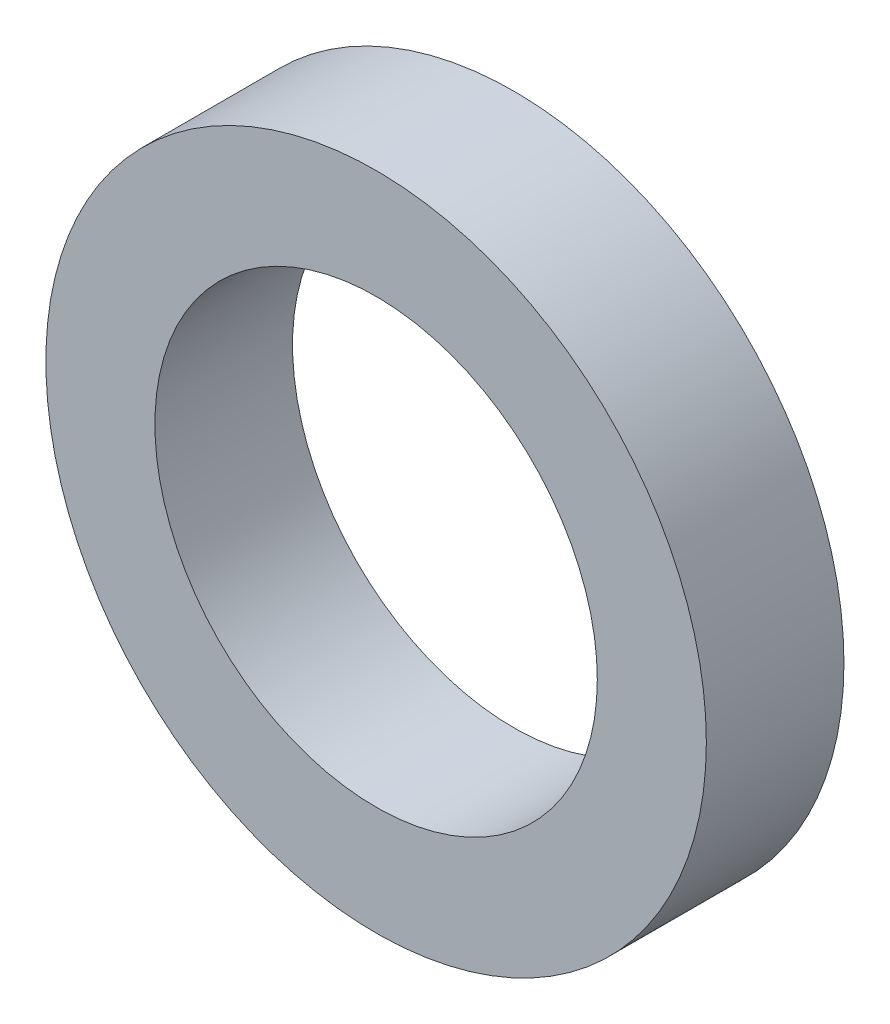
ISO-10303-21;
HEADER;
FILE_DESCRIPTION(('STEP AP214'),'2;1');
FILE_NAME('part.step','',(''),(''),'','','');
FILE_SCHEMA(('AUTOMOTIVE_DESIGN { 1 0 10303 214 1 1 1 1 }'));
ENDSEC;
DATA;
#1=APPLICATION_CONTEXT('core data for automotive mechanical design processes');
#2=APPLICATION_PROTOCOL_DEFINITION('international standard','automotive_design',2000,#1);
#3=PRODUCT_CONTEXT('',#1,'mechanical');
#4=PRODUCT('Part','Part','',(#3));
#5=PRODUCT_RELATED_PRODUCT_CATEGORY('part','',(#4));
#6=PRODUCT_DEFINITION_FORMATION('','',#4);
#7=PRODUCT_DEFINITION_CONTEXT('part definition',#1,'design');
#8=PRODUCT_DEFINITION('design','',#6,#7);
#9=PRODUCT_DEFINITION_SHAPE('','',#8);
#10=(LENGTH_UNIT() NAMED_UNIT(*) SI_UNIT(.MILLI.,.METRE.));
#11=(NAMED_UNIT(*) PLANE_ANGLE_UNIT() SI_UNIT($,.RADIAN.));
#12=(NAMED_UNIT(*) SI_UNIT($,.STERADIAN.) SOLID_ANGLE_UNIT());
#13=UNCERTAINTY_MEASURE_WITH_UNIT(LENGTH_MEASURE(1.E-05),#10,'distance_accuracy_value','');
#14=(GEOMETRIC_REPRESENTATION_CONTEXT(3) GLOBAL_UNCERTAINTY_ASSIGNED_CONTEXT((#13)) GLOBAL_UNIT_ASSIGNED_CONTEXT((#10,
#11,#12)) REPRESENTATION_CONTEXT('',''));
#15=CARTESIAN_POINT('',(0.,0.,0.));
#16=DIRECTION('',(0.,0.,1.));
#17=DIRECTION('',(1.,0.,0.));
#18=AXIS2_PLACEMENT_3D('',#15,#16,#17);
#19=CARTESIAN_POINT('',(0.,0.,20.));
#20=DIRECTION('',(0.,0.,1.));
#21=DIRECTION('',(1.,0.,0.));
#22=AXIS2_PLACEMENT_3D('',#19,#20,#21);
#23=PLANE('',#22);
#24=CARTESIAN_POINT('',(0.,0.,20.));
#25=DIRECTION('',(0.,0.,1.));
#26=DIRECTION('',(1.,0.,0.));
#27=AXIS2_PLACEMENT_3D('',#24,#25,#26);
#28=CIRCLE('',#27,48.);
#29=CARTESIAN_POINT('',(48.,0.,20.));
#30=VERTEX_POINT('',#29);
#31=EDGE_CURVE('E10',#30,#30,#28,.T.);
#32=ORIENTED_EDGE('',*,*,#31,.T.);
#33=EDGE_LOOP('',(#32));
#34=FACE_BOUND('',#33,.T.);
#35=CARTESIAN_POINT('',(0.,0.,20.));
#36=DIRECTION('',(0.,0.,1.));
#37=DIRECTION('',(1.,0.,0.));
#38=AXIS2_PLACEMENT_3D('',#35,#36,#37);
#39=CIRCLE('',#38,32.15);
#40=CARTESIAN_POINT('',(32.15,0.,20.));
#41=VERTEX_POINT('',#40);
#42=EDGE_CURVE('E48',#41,#41,#39,.T.);
#43=ORIENTED_EDGE('',*,*,#42,.F.);
#44=EDGE_LOOP('',(#43));
#45=FACE_BOUND('',#44,.T.);
#46=ADVANCED_FACE('F40',(#34,#45),#23,.T.);
#47=CARTESIAN_POINT('',(0.,0.,0.));
#48=DIRECTION('',(0.,0.,1.));
#49=DIRECTION('',(1.,0.,0.));
#50=AXIS2_PLACEMENT_3D('',#47,#48,#49);
#51=PLANE('',#50);
#52=CARTESIAN_POINT('',(0.,0.,0.));
#53=DIRECTION('',(0.,0.,1.));
#54=DIRECTION('',(1.,0.,0.));
#55=AXIS2_PLACEMENT_3D('',#52,#53,#54);
#56=CIRCLE('',#55,48.);
#57=CARTESIAN_POINT('',(48.,0.,0.));
#58=VERTEX_POINT('',#57);
#59=EDGE_CURVE('E41',#58,#58,#56,.T.);
#60=ORIENTED_EDGE('',*,*,#59,.F.);
#61=EDGE_LOOP('',(#60));
#62=FACE_BOUND('',#61,.T.);
#63=CARTESIAN_POINT('',(0.,0.,0.));
#64=DIRECTION('',(0.,0.,1.));
#65=DIRECTION('',(1.,0.,0.));
#66=AXIS2_PLACEMENT_3D('',#63,#64,#65);
#67=CIRCLE('',#66,32.15);
#68=CARTESIAN_POINT('',(32.15,0.,0.));
#69=VERTEX_POINT('',#68);
#70=EDGE_CURVE('E49',#69,#69,#67,.T.);
#71=ORIENTED_EDGE('',*,*,#70,.T.);
#72=EDGE_LOOP('',(#71));
#73=FACE_BOUND('',#72,.T.);
#74=ADVANCED_FACE('F58',(#62,#73),#51,.F.);
#75=CARTESIAN_POINT('',(0.,0.,20.));
#76=DIRECTION('',(0.,0.,-1.));
#77=DIRECTION('',(-1.,0.,0.));
#78=AXIS2_PLACEMENT_3D('',#75,#76,#77);
#79=CYLINDRICAL_SURFACE('',#78,48.);
#80=ORIENTED_EDGE('',*,*,#31,.F.);
#81=EDGE_LOOP('',(#80));
#82=FACE_BOUND('',#81,.T.);
#83=ORIENTED_EDGE('',*,*,#59,.T.);
#84=EDGE_LOOP('',(#83));
#85=FACE_BOUND('',#84,.T.);
#86=ADVANCED_FACE('F39',(#82,#85),#79,.T.);
#87=CARTESIAN_POINT('',(0.,0.,20.));
#88=DIRECTION('',(0.,0.,-1.));
#89=DIRECTION('',(-1.,0.,0.));
#90=AXIS2_PLACEMENT_3D('',#87,#88,#89);
#91=CYLINDRICAL_SURFACE('',#90,32.15);
#92=ORIENTED_EDGE('',*,*,#42,.T.);
#93=EDGE_LOOP('',(#92));
#94=FACE_BOUND('',#93,.T.);
#95=ORIENTED_EDGE('',*,*,#70,.F.);
#96=EDGE_LOOP('',(#95));
#97=FACE_BOUND('',#96,.T.);
#98=ADVANCED_FACE('F57',(#94,#97),#91,.F.);
#99=CLOSED_SHELL('',(#46,#74,#86,#98));
#100=MANIFOLD_SOLID_BREP('B2',#99);
#101=ADVANCED_BREP_SHAPE_REPRESENTATION('',(#18,#100),#14);
#102=SHAPE_DEFINITION_REPRESENTATION(#9,#101);
ENDSEC;
END-ISO-10303-21;
